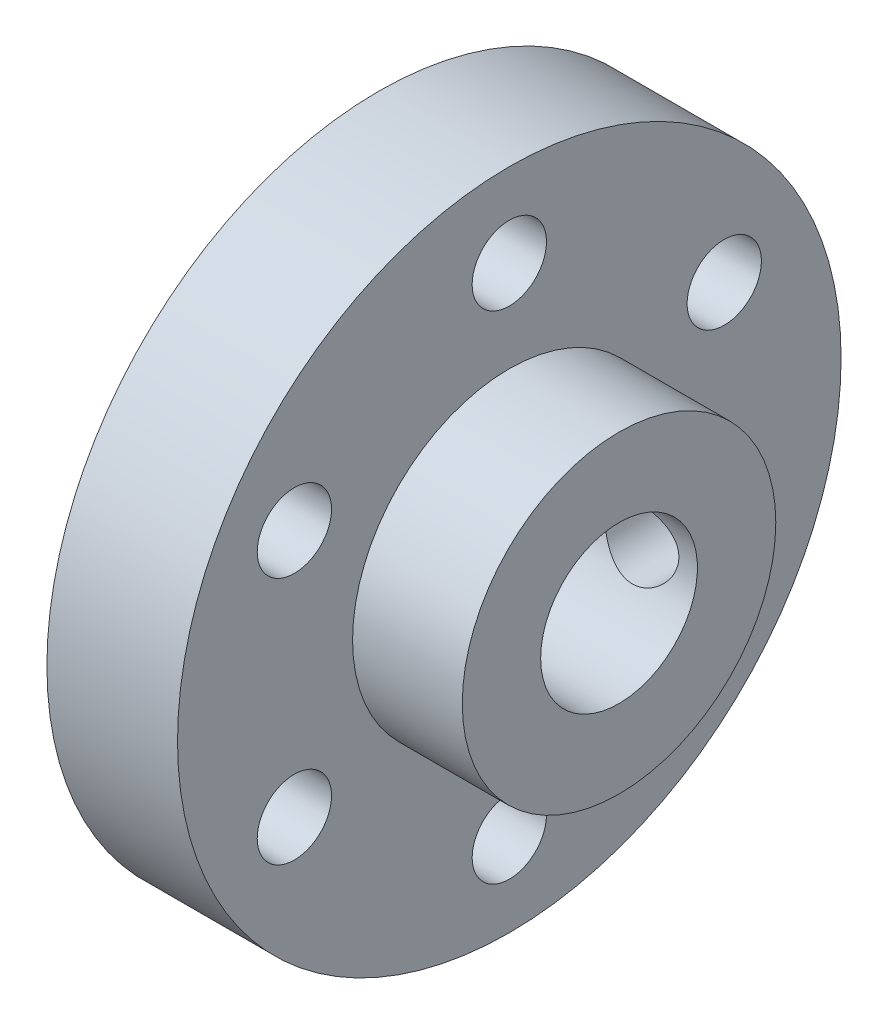
ISO-10303-21;
HEADER;
FILE_DESCRIPTION(('STEP AP214'),'2;1');
FILE_NAME('part.step','',(''),(''),'','','');
FILE_SCHEMA(('AUTOMOTIVE_DESIGN { 1 0 10303 214 1 1 1 1 }'));
ENDSEC;
DATA;
#1=APPLICATION_CONTEXT('core data for automotive mechanical design processes');
#2=APPLICATION_PROTOCOL_DEFINITION('international standard','automotive_design',2000,#1);
#3=PRODUCT_CONTEXT('',#1,'mechanical');
#4=PRODUCT('Part','Part','',(#3));
#5=PRODUCT_RELATED_PRODUCT_CATEGORY('part','',(#4));
#6=PRODUCT_DEFINITION_FORMATION('','',#4);
#7=PRODUCT_DEFINITION_CONTEXT('part definition',#1,'design');
#8=PRODUCT_DEFINITION('design','',#6,#7);
#9=PRODUCT_DEFINITION_SHAPE('','',#8);
#10=(LENGTH_UNIT() NAMED_UNIT(*) SI_UNIT(.MILLI.,.METRE.));
#11=(NAMED_UNIT(*) PLANE_ANGLE_UNIT() SI_UNIT($,.RADIAN.));
#12=(NAMED_UNIT(*) SI_UNIT($,.STERADIAN.) SOLID_ANGLE_UNIT());
#13=UNCERTAINTY_MEASURE_WITH_UNIT(LENGTH_MEASURE(1.E-05),#10,'distance_accuracy_value','');
#14=(GEOMETRIC_REPRESENTATION_CONTEXT(3) GLOBAL_UNCERTAINTY_ASSIGNED_CONTEXT((#13)) GLOBAL_UNIT_ASSIGNED_CONTEXT((#10,
#11,#12)) REPRESENTATION_CONTEXT('',''));
#15=CARTESIAN_POINT('',(0.,0.,0.));
#16=DIRECTION('',(0.,0.,1.));
#17=DIRECTION('',(1.,0.,0.));
#18=AXIS2_PLACEMENT_3D('',#15,#16,#17);
#19=CARTESIAN_POINT('',(9.2,0.,0.));
#20=DIRECTION('',(-1.,0.,0.));
#21=DIRECTION('',(0.,0.,1.));
#22=AXIS2_PLACEMENT_3D('',#19,#20,#21);
#23=CYLINDRICAL_SURFACE('',#22,12.7);
#24=CARTESIAN_POINT('',(3.89168749593449,0.,-12.7));
#25=CARTESIAN_POINT('',(3.89168407550333,0.0796293042126381,-12.6999989871327));
#26=CARTESIAN_POINT('',(3.88497821343914,0.159309950896182,-12.6992431474695));
#27=CARTESIAN_POINT('',(3.8583305375107,0.31645848229174,-12.6963006434276));
#28=CARTESIAN_POINT('',(3.83837448580765,0.39392389314896,-12.6941124399546));
#29=CARTESIAN_POINT('',(3.78581789531775,0.544343810683809,-12.6885519930145));
#30=CARTESIAN_POINT('',(3.75322539065561,0.617301149445109,-12.6851805019979));
#31=CARTESIAN_POINT('',(3.67633759800329,0.756695153161773,-12.6776295583631));
#32=CARTESIAN_POINT('',(3.63204449185674,0.823133030654698,-12.6734502564185));
#33=CARTESIAN_POINT('',(3.53280106281343,0.947913698891423,-12.6647302938183));
#34=CARTESIAN_POINT('',(3.47780905592805,1.00622324398845,-12.6601882621157));
#35=CARTESIAN_POINT('',(3.35881809390447,1.11280602567313,-12.6512659624337));
#36=CARTESIAN_POINT('',(3.29481870381705,1.16107877732429,-12.6468857022788));
#37=CARTESIAN_POINT('',(3.15941766646372,1.24633844237432,-12.6387691712029));
#38=CARTESIAN_POINT('',(3.08799663357491,1.28329475116734,-12.6350346583187));
#39=CARTESIAN_POINT('',(2.93991358063971,1.34467705488147,-12.6286500332387));
#40=CARTESIAN_POINT('',(2.86325172127854,1.36910343377865,-12.6259998878133));
#41=CARTESIAN_POINT('',(2.70720530463408,1.40463271970905,-12.6220968271518));
#42=CARTESIAN_POINT('',(2.62783356641104,1.4157912768195,-12.6208380774707));
#43=CARTESIAN_POINT('',(2.4683347100286,1.42464027431553,-12.6198423534604));
#44=CARTESIAN_POINT('',(2.38820761655593,1.42233115334263,-12.6201053295686));
#45=CARTESIAN_POINT('',(2.22985807794076,1.40435612322354,-12.6221180087784));
#46=CARTESIAN_POINT('',(2.15162860942137,1.38875121819029,-12.6238609214664));
#47=CARTESIAN_POINT('',(1.99890590862589,1.34472262504097,-12.628626495775));
#48=CARTESIAN_POINT('',(1.9244127383341,1.31629872433892,-12.6316491786188));
#49=CARTESIAN_POINT('',(1.78108595579678,1.24737245508685,-12.638641481814));
#50=CARTESIAN_POINT('',(1.71226534471491,1.20684327315166,-12.642613200347));
#51=CARTESIAN_POINT('',(1.58237960169225,1.11487614264004,-12.651054366044));
#52=CARTESIAN_POINT('',(1.5213147548094,1.06343779328984,-12.6555238314909));
#53=CARTESIAN_POINT('',(1.40831963582293,0.95077294336789,-12.664487130628));
#54=CARTESIAN_POINT('',(1.35644183407033,0.889493803968468,-12.6689809621673));
#55=CARTESIAN_POINT('',(1.263700950406,0.759068945739561,-12.677463381429));
#56=CARTESIAN_POINT('',(1.22283788612238,0.689923214320563,-12.6814519683428));
#57=CARTESIAN_POINT('',(1.15328756658665,0.545689750760288,-12.6884763050648));
#58=CARTESIAN_POINT('',(1.12460325540648,0.470600587062248,-12.6915118244338));
#59=CARTESIAN_POINT('',(1.08026458278106,0.316630152907063,-12.69628579102));
#60=CARTESIAN_POINT('',(1.06460973215955,0.237749024932517,-12.6980242869321));
#61=CARTESIAN_POINT('',(1.04684158083999,0.0788878778733906,-12.7000020392876));
#62=CARTESIAN_POINT('',(1.04465593186219,-0.00108395360230105,-12.7002493055474));
#63=CARTESIAN_POINT('',(1.05369779483497,-0.160254835508478,-12.6992382836766));
#64=CARTESIAN_POINT('',(1.06492507852505,-0.239453899066757,-12.6979800211671));
#65=CARTESIAN_POINT('',(1.10041404448931,-0.39462014791938,-12.6941043777926));
#66=CARTESIAN_POINT('',(1.12464156984857,-0.470595241958787,-12.6914905591246));
#67=CARTESIAN_POINT('',(1.18540800183802,-0.617403450816285,-12.6851967512027));
#68=CARTESIAN_POINT('',(1.22194724995903,-0.68823642294086,-12.6815167323759));
#69=CARTESIAN_POINT('',(1.30647735055756,-0.823075008004148,-12.6734815498615));
#70=CARTESIAN_POINT('',(1.35451540517911,-0.887050863020743,-12.6691236299357));
#71=CARTESIAN_POINT('',(1.46061222588598,-1.0060572548423,-12.6602297305019));
#72=CARTESIAN_POINT('',(1.51867130905044,-1.06108750848909,-12.6556937453631));
#73=CARTESIAN_POINT('',(1.64347916605927,-1.16089428800412,-12.6469305654468));
#74=CARTESIAN_POINT('',(1.71026620547669,-1.20562311310534,-12.642704866546));
#75=CARTESIAN_POINT('',(1.85044679166697,-1.28322870319522,-12.635064351553));
#76=CARTESIAN_POINT('',(1.92384022857086,-1.31610566524307,-12.631649521979));
#77=CARTESIAN_POINT('',(2.07499104239227,-1.36899560100578,-12.6260271560458));
#78=CARTESIAN_POINT('',(2.15273862367222,-1.38903628119628,-12.6238170209615));
#79=CARTESIAN_POINT('',(2.31052152899563,-1.41577437973492,-12.6208465174718));
#80=CARTESIAN_POINT('',(2.39055676900608,-1.42247228756836,-12.620086095883));
#81=CARTESIAN_POINT('',(2.55016880184294,-1.42232693358569,-12.6201024413793));
#82=CARTESIAN_POINT('',(2.62974567428931,-1.41555860254547,-12.6208707023522));
#83=CARTESIAN_POINT('',(2.78662381672738,-1.38883071717907,-12.6238396456315));
#84=CARTESIAN_POINT('',(2.86392508510624,-1.36887115350393,-12.6260403289532));
#85=CARTESIAN_POINT('',(3.01405288896598,-1.31634933598876,-12.6316236747729));
#86=CARTESIAN_POINT('',(3.08688043201978,-1.28378993203385,-12.6350060699695));
#87=CARTESIAN_POINT('',(3.22604957135175,-1.20700017200153,-12.6425722291317));
#88=CARTESIAN_POINT('',(3.2923911502871,-1.16276978471822,-12.64675599524));
#89=CARTESIAN_POINT('',(3.41708890157704,-1.06361349101632,-12.6554814059422));
#90=CARTESIAN_POINT('',(3.47540050581258,-1.00863169147623,-12.6600248435396));
#91=CARTESIAN_POINT('',(3.58200037187087,-0.889647504417425,-12.6689415011601));
#92=CARTESIAN_POINT('',(3.63028624762758,-0.825642975612048,-12.673314680462));
#93=CARTESIAN_POINT('',(3.71558639267365,-0.690208318791703,-12.681412588346));
#94=CARTESIAN_POINT('',(3.75256540482219,-0.618755876946853,-12.6851352733957));
#95=CARTESIAN_POINT('',(3.81394924118907,-0.470656917760391,-12.6914913703169));
#96=CARTESIAN_POINT('',(3.83836801098677,-0.394016268359459,-12.6941259896191));
#97=CARTESIAN_POINT('',(3.86795904168752,-0.26413176330473,-12.6973592103633));
#98=CARTESIAN_POINT('',(3.87684477192835,-0.211713399275616,-12.6983447957744));
#99=CARTESIAN_POINT('',(3.88871012353418,-0.106204301833843,-12.6996655265998));
#100=CARTESIAN_POINT('',(3.89168977739756,-0.0531135721225154,-12.700000675593));
#101=CARTESIAN_POINT('',(3.89168749593449,0.,-12.7));
#102=B_SPLINE_CURVE_WITH_KNOTS('',3,(#24,#25,#26,#27,#28,#29,#30,#31,#32,#33,#34,#35,#36,#37,
#38,#39,#40,#41,#42,#43,#44,#45,#46,#47,#48,#49,#50,#51,#52,#53,#54,#55,#56,#57,#58,#59,#60,#61,
#62,#63,#64,#65,#66,#67,#68,#69,#70,#71,#72,#73,#74,#75,#76,#77,#78,#79,#80,#81,#82,#83,#84,#85,
#86,#87,#88,#89,#90,#91,#92,#93,#94,#95,#96,#97,#98,#99,#100,#101),.UNSPECIFIED.,.T.,.F.,(4,2,2,
2,2,2,2,2,2,2,2,2,2,2,2,2,2,2,2,2,2,2,2,2,2,2,2,2,2,2,2,2,2,2,2,2,2,2,4),(0.,0.238693936836993,
0.477644775482566,0.716443940156791,0.955198606683063,1.19490281907231,1.43461861029127,
1.67497708578614,1.91532819512503,2.15466758759963,2.39399918484726,2.6322385508201,
2.87048186782087,3.10925686113529,3.3480406279273,3.58814702871219,3.82825381376321,
4.06841860883549,4.30857438678746,4.54743906296058,4.7862996742067,5.02453575274213,
5.2627784397865,5.50201640129647,5.7412619340131,5.98159396585652,6.22192200154989,
6.46172953732751,6.70152827550158,6.93999642276735,7.17846473904161,7.4168791490403,
7.65529419651833,7.89498332033177,8.13472942356464,8.37521565509708,8.61543429636363,
8.77464650493228,8.93385783742797),.UNSPECIFIED.);
#103=CARTESIAN_POINT('',(3.89168749593449,0.,-12.7));
#104=VERTEX_POINT('',#103);
#105=EDGE_CURVE('E76',#104,#104,#102,.T.);
#106=ORIENTED_EDGE('',*,*,#105,.T.);
#107=EDGE_LOOP('',(#106));
#108=FACE_BOUND('',#107,.T.);
#109=CARTESIAN_POINT('',(0.,0.,0.));
#110=DIRECTION('',(1.,0.,0.));
#111=DIRECTION('',(0.,0.,-1.));
#112=AXIS2_PLACEMENT_3D('',#109,#110,#111);
#113=CIRCLE('',#112,12.7);
#114=CARTESIAN_POINT('',(0.,0.,-12.7));
#115=VERTEX_POINT('',#114);
#116=EDGE_CURVE('E10',#115,#115,#113,.T.);
#117=ORIENTED_EDGE('',*,*,#116,.T.);
#118=EDGE_LOOP('',(#117));
#119=FACE_BOUND('',#118,.T.);
#120=CARTESIAN_POINT('',(5.,0.,0.));
#121=DIRECTION('',(1.,0.,0.));
#122=DIRECTION('',(0.,0.,-1.));
#123=AXIS2_PLACEMENT_3D('',#120,#121,#122);
#124=CIRCLE('',#123,12.7);
#125=CARTESIAN_POINT('',(5.,0.,-12.7));
#126=VERTEX_POINT('',#125);
#127=EDGE_CURVE('E43',#126,#126,#124,.T.);
#128=ORIENTED_EDGE('',*,*,#127,.F.);
#129=EDGE_LOOP('',(#128));
#130=FACE_BOUND('',#129,.T.);
#131=ADVANCED_FACE('F31',(#108,#119,#130),#23,.T.);
#132=CARTESIAN_POINT('',(0.,0.,0.));
#133=DIRECTION('',(1.,0.,0.));
#134=DIRECTION('',(0.,0.,-1.));
#135=AXIS2_PLACEMENT_3D('',#132,#133,#134);
#136=PLANE('',#135);
#137=CARTESIAN_POINT('',(0.,-4.74999999999998,8.22724133595218));
#138=DIRECTION('',(-1.,0.,0.));
#139=DIRECTION('',(0.,0.,1.));
#140=AXIS2_PLACEMENT_3D('',#137,#138,#139);
#141=CIRCLE('',#140,1.4224);
#142=CARTESIAN_POINT('',(0.,-4.74999999999998,9.64964133595218));
#143=VERTEX_POINT('',#142);
#144=EDGE_CURVE('E99',#143,#143,#141,.T.);
#145=ORIENTED_EDGE('',*,*,#144,.F.);
#146=EDGE_LOOP('',(#145));
#147=FACE_BOUND('',#146,.T.);
#148=CARTESIAN_POINT('',(0.,-9.5,0.));
#149=DIRECTION('',(-1.,0.,0.));
#150=DIRECTION('',(0.,0.,1.));
#151=AXIS2_PLACEMENT_3D('',#148,#149,#150);
#152=CIRCLE('',#151,1.4224);
#153=CARTESIAN_POINT('',(0.,-9.5,1.42240000000003));
#154=VERTEX_POINT('',#153);
#155=EDGE_CURVE('E106',#154,#154,#152,.T.);
#156=ORIENTED_EDGE('',*,*,#155,.F.);
#157=EDGE_LOOP('',(#156));
#158=FACE_BOUND('',#157,.T.);
#159=CARTESIAN_POINT('',(0.,9.5,0.));
#160=DIRECTION('',(-1.,0.,0.));
#161=DIRECTION('',(0.,0.,1.));
#162=AXIS2_PLACEMENT_3D('',#159,#160,#161);
#163=CIRCLE('',#162,1.4224);
#164=CARTESIAN_POINT('',(0.,9.5,1.4224));
#165=VERTEX_POINT('',#164);
#166=EDGE_CURVE('E102',#165,#165,#163,.T.);
#167=ORIENTED_EDGE('',*,*,#166,.F.);
#168=EDGE_LOOP('',(#167));
#169=FACE_BOUND('',#168,.T.);
#170=CARTESIAN_POINT('',(0.,4.7499999999999,-8.22724133595223));
#171=DIRECTION('',(-1.,0.,0.));
#172=DIRECTION('',(0.,0.,1.));
#173=AXIS2_PLACEMENT_3D('',#170,#171,#172);
#174=CIRCLE('',#173,1.4224);
#175=CARTESIAN_POINT('',(0.,4.7499999999999,-6.80484133595223));
#176=VERTEX_POINT('',#175);
#177=EDGE_CURVE('E105',#176,#176,#174,.T.);
#178=ORIENTED_EDGE('',*,*,#177,.F.);
#179=EDGE_LOOP('',(#178));
#180=FACE_BOUND('',#179,.T.);
#181=CARTESIAN_POINT('',(0.,4.74999999999998,8.22724133595218));
#182=DIRECTION('',(-1.,0.,0.));
#183=DIRECTION('',(0.,0.,1.));
#184=AXIS2_PLACEMENT_3D('',#181,#182,#183);
#185=CIRCLE('',#184,1.4224);
#186=CARTESIAN_POINT('',(0.,4.74999999999998,9.64964133595218));
#187=VERTEX_POINT('',#186);
#188=EDGE_CURVE('E113',#187,#187,#185,.T.);
#189=ORIENTED_EDGE('',*,*,#188,.F.);
#190=EDGE_LOOP('',(#189));
#191=FACE_BOUND('',#190,.T.);
#192=CARTESIAN_POINT('',(0.,-4.75000000000007,-8.22724133595213));
#193=DIRECTION('',(-1.,0.,0.));
#194=DIRECTION('',(0.,0.,1.));
#195=AXIS2_PLACEMENT_3D('',#192,#193,#194);
#196=CIRCLE('',#195,1.4224);
#197=CARTESIAN_POINT('',(0.,-4.75000000000007,-6.80484133595213));
#198=VERTEX_POINT('',#197);
#199=EDGE_CURVE('E56',#198,#198,#196,.T.);
#200=ORIENTED_EDGE('',*,*,#199,.F.);
#201=EDGE_LOOP('',(#200));
#202=FACE_BOUND('',#201,.T.);
#203=CARTESIAN_POINT('',(0.,0.,0.));
#204=DIRECTION('',(-1.,0.,0.));
#205=DIRECTION('',(0.,0.,1.));
#206=AXIS2_PLACEMENT_3D('',#203,#204,#205);
#207=CIRCLE('',#206,3.);
#208=CARTESIAN_POINT('',(0.,0.,3.));
#209=VERTEX_POINT('',#208);
#210=EDGE_CURVE('E70',#209,#209,#207,.T.);
#211=ORIENTED_EDGE('',*,*,#210,.F.);
#212=EDGE_LOOP('',(#211));
#213=FACE_BOUND('',#212,.T.);
#214=ORIENTED_EDGE('',*,*,#116,.F.);
#215=EDGE_LOOP('',(#214));
#216=FACE_BOUND('',#215,.T.);
#217=ADVANCED_FACE('F140',(#147,#158,#169,#180,#191,#202,#213,#216),#136,.F.);
#218=CARTESIAN_POINT('',(5.,0.,0.));
#219=DIRECTION('',(1.,0.,0.));
#220=DIRECTION('',(0.,0.,-1.));
#221=AXIS2_PLACEMENT_3D('',#218,#219,#220);
#222=PLANE('',#221);
#223=CARTESIAN_POINT('',(5.,-4.74999999999998,8.22724133595218));
#224=DIRECTION('',(1.,0.,0.));
#225=DIRECTION('',(0.,0.,-1.));
#226=AXIS2_PLACEMENT_3D('',#223,#224,#225);
#227=CIRCLE('',#226,1.4224);
#228=CARTESIAN_POINT('',(5.,-4.74999999999998,6.80484133595218));
#229=VERTEX_POINT('',#228);
#230=EDGE_CURVE('E68',#229,#229,#227,.T.);
#231=ORIENTED_EDGE('',*,*,#230,.F.);
#232=EDGE_LOOP('',(#231));
#233=FACE_BOUND('',#232,.T.);
#234=CARTESIAN_POINT('',(5.,-9.5,0.));
#235=DIRECTION('',(1.,0.,0.));
#236=DIRECTION('',(0.,0.,-1.));
#237=AXIS2_PLACEMENT_3D('',#234,#235,#236);
#238=CIRCLE('',#237,1.4224);
#239=CARTESIAN_POINT('',(5.,-9.5,-1.42239999999997));
#240=VERTEX_POINT('',#239);
#241=EDGE_CURVE('E65',#240,#240,#238,.T.);
#242=ORIENTED_EDGE('',*,*,#241,.F.);
#243=EDGE_LOOP('',(#242));
#244=FACE_BOUND('',#243,.T.);
#245=CARTESIAN_POINT('',(5.,9.5,0.));
#246=DIRECTION('',(1.,0.,0.));
#247=DIRECTION('',(0.,0.,-1.));
#248=AXIS2_PLACEMENT_3D('',#245,#246,#247);
#249=CIRCLE('',#248,1.4224);
#250=CARTESIAN_POINT('',(5.,9.5,-1.4224));
#251=VERTEX_POINT('',#250);
#252=EDGE_CURVE('E62',#251,#251,#249,.T.);
#253=ORIENTED_EDGE('',*,*,#252,.F.);
#254=EDGE_LOOP('',(#253));
#255=FACE_BOUND('',#254,.T.);
#256=CARTESIAN_POINT('',(5.,4.7499999999999,-8.22724133595223));
#257=DIRECTION('',(1.,0.,0.));
#258=DIRECTION('',(0.,0.,-1.));
#259=AXIS2_PLACEMENT_3D('',#256,#257,#258);
#260=CIRCLE('',#259,1.4224);
#261=CARTESIAN_POINT('',(5.,4.7499999999999,-9.64964133595223));
#262=VERTEX_POINT('',#261);
#263=EDGE_CURVE('E59',#262,#262,#260,.T.);
#264=ORIENTED_EDGE('',*,*,#263,.F.);
#265=EDGE_LOOP('',(#264));
#266=FACE_BOUND('',#265,.T.);
#267=CARTESIAN_POINT('',(5.,4.74999999999998,8.22724133595218));
#268=DIRECTION('',(1.,0.,0.));
#269=DIRECTION('',(0.,0.,-1.));
#270=AXIS2_PLACEMENT_3D('',#267,#268,#269);
#271=CIRCLE('',#270,1.4224);
#272=CARTESIAN_POINT('',(5.,4.74999999999998,6.80484133595218));
#273=VERTEX_POINT('',#272);
#274=EDGE_CURVE('E55',#273,#273,#271,.T.);
#275=ORIENTED_EDGE('',*,*,#274,.F.);
#276=EDGE_LOOP('',(#275));
#277=FACE_BOUND('',#276,.T.);
#278=CARTESIAN_POINT('',(5.,-4.75000000000007,-8.22724133595213));
#279=DIRECTION('',(1.,0.,0.));
#280=DIRECTION('',(0.,0.,-1.));
#281=AXIS2_PLACEMENT_3D('',#278,#279,#280);
#282=CIRCLE('',#281,1.4224);
#283=CARTESIAN_POINT('',(5.,-4.75000000000007,-9.64964133595213));
#284=VERTEX_POINT('',#283);
#285=EDGE_CURVE('E52',#284,#284,#282,.T.);
#286=ORIENTED_EDGE('',*,*,#285,.F.);
#287=EDGE_LOOP('',(#286));
#288=FACE_BOUND('',#287,.T.);
#289=CARTESIAN_POINT('',(5.,0.,0.));
#290=DIRECTION('',(1.,0.,0.));
#291=DIRECTION('',(0.,0.,-1.));
#292=AXIS2_PLACEMENT_3D('',#289,#290,#291);
#293=CIRCLE('',#292,6.);
#294=CARTESIAN_POINT('',(5.,0.,-6.));
#295=VERTEX_POINT('',#294);
#296=EDGE_CURVE('E48',#295,#295,#293,.T.);
#297=ORIENTED_EDGE('',*,*,#296,.F.);
#298=EDGE_LOOP('',(#297));
#299=FACE_BOUND('',#298,.T.);
#300=ORIENTED_EDGE('',*,*,#127,.T.);
#301=EDGE_LOOP('',(#300));
#302=FACE_BOUND('',#301,.T.);
#303=ADVANCED_FACE('F132',(#233,#244,#255,#266,#277,#288,#299,#302),#222,.T.);
#304=CARTESIAN_POINT('',(5.,0.,0.));
#305=DIRECTION('',(1.,0.,0.));
#306=DIRECTION('',(0.,0.,-1.));
#307=AXIS2_PLACEMENT_3D('',#304,#305,#306);
#308=CYLINDRICAL_SURFACE('',#307,6.);
#309=CARTESIAN_POINT('',(5.64688749593449,0.,-6.));
#310=CARTESIAN_POINT('',(5.64688992597994,0.0787177685685404,-5.99999859765227));
#311=CARTESIAN_POINT('',(5.65344405940375,0.157463586606879,-5.9984353102767));
#312=CARTESIAN_POINT('',(5.67945334707992,0.312706951877036,-5.99235030537756));
#313=CARTESIAN_POINT('',(5.69891662899273,0.389203050967231,-5.98782672406298));
#314=CARTESIAN_POINT('',(5.75009125820451,0.53768196791325,-5.9763232316239));
#315=CARTESIAN_POINT('',(5.78178870892622,0.609669799189784,-5.96934610823121));
#316=CARTESIAN_POINT('',(5.85648501588576,0.747305003081661,-5.95368284360752));
#317=CARTESIAN_POINT('',(5.89948396992746,0.812952320819115,-5.94499668758661));
#318=CARTESIAN_POINT('',(5.99641083383026,0.937268897817115,-5.92668082432269));
#319=CARTESIAN_POINT('',(6.05050963563338,0.995802957166398,-5.91703775677153));
#320=CARTESIAN_POINT('',(6.16773422109844,1.10305753643497,-5.89798592631227));
#321=CARTESIAN_POINT('',(6.23086092634157,1.1517770532474,-5.88857718744002));
#322=CARTESIAN_POINT('',(6.36537765455918,1.23863849545355,-5.87092594921982));
#323=CARTESIAN_POINT('',(6.4368657477476,1.27663231923114,-5.86270048224347));
#324=CARTESIAN_POINT('',(6.58544006738293,1.34001251065078,-5.84854069205495));
#325=CARTESIAN_POINT('',(6.66252549527901,1.36540067266061,-5.84260604278041));
#326=CARTESIAN_POINT('',(6.81862798519744,1.40239378445991,-5.83383664464704));
#327=CARTESIAN_POINT('',(6.89758469227601,1.41424026983096,-5.8309476473232));
#328=CARTESIAN_POINT('',(7.05641361927348,1.42456555121915,-5.82843404894199));
#329=CARTESIAN_POINT('',(7.13628570438899,1.42304629091251,-5.82880897323786));
#330=CARTESIAN_POINT('',(7.29285114497425,1.40687662729339,-5.83273194062304));
#331=CARTESIAN_POINT('',(7.36957588919922,1.39251088783242,-5.83621119152143));
#332=CARTESIAN_POINT('',(7.51949418283249,1.35150882325018,-5.84584153207246));
#333=CARTESIAN_POINT('',(7.59268750307871,1.32487170299126,-5.85199279485958));
#334=CARTESIAN_POINT('',(7.73424434794727,1.25983244633938,-5.86633918737308));
#335=CARTESIAN_POINT('',(7.80255727348691,1.22132438134918,-5.87455259061684));
#336=CARTESIAN_POINT('',(7.93185523015639,1.13371058158765,-5.89208713038852));
#337=CARTESIAN_POINT('',(7.99283909679994,1.08460316618235,-5.90140844248114));
#338=CARTESIAN_POINT('',(8.10738249642011,0.975696221511965,-5.92040055727288));
#339=CARTESIAN_POINT('',(8.16071264645173,0.915655658729797,-5.93007420591432));
#340=CARTESIAN_POINT('',(8.25658819533763,0.787369749450404,-5.9484654543337));
#341=CARTESIAN_POINT('',(8.2991333267874,0.719124199580002,-5.95718303040366));
#342=CARTESIAN_POINT('',(8.37230339351258,0.576058624576064,-5.9727164434281));
#343=CARTESIAN_POINT('',(8.40289416839688,0.501220496748445,-5.97952681492579));
#344=CARTESIAN_POINT('',(8.4509994115948,0.347267573819371,-5.9904384313872));
#345=CARTESIAN_POINT('',(8.46851612247247,0.268153514656363,-5.99454014094754));
#346=CARTESIAN_POINT('',(8.48963286443022,0.109858377343459,-5.99950464928435));
#347=CARTESIAN_POINT('',(8.493545669019,0.0307212468331392,-6.00044022831377));
#348=CARTESIAN_POINT('',(8.48819705033458,-0.127076389632865,-5.99917291906086));
#349=CARTESIAN_POINT('',(8.47893668629691,-0.205736933399472,-5.99697028311786));
#350=CARTESIAN_POINT('',(8.44776315996342,-0.359283299987231,-5.98972037893135));
#351=CARTESIAN_POINT('',(8.42601781351043,-0.434205135738388,-5.98471086027588));
#352=CARTESIAN_POINT('',(8.3706809476893,-0.579335720479553,-5.97240981882881));
#353=CARTESIAN_POINT('',(8.33708830619995,-0.64954402227526,-5.96511807988317));
#354=CARTESIAN_POINT('',(8.25838487839401,-0.784520103628585,-5.94888466699777));
#355=CARTESIAN_POINT('',(8.21309522895961,-0.849180517448246,-5.93991803068973));
#356=CARTESIAN_POINT('',(8.11251491250953,-0.970095243664806,-5.92137345499039));
#357=CARTESIAN_POINT('',(8.05722270311258,-1.02634825720553,-5.91179542147006));
#358=CARTESIAN_POINT('',(7.93676123428309,-1.13011820261883,-5.89285001902268));
#359=CARTESIAN_POINT('',(7.87140219349156,-1.17741684582211,-5.88349185675045));
#360=CARTESIAN_POINT('',(7.73348716743581,-1.26037092410306,-5.86628221735316));
#361=CARTESIAN_POINT('',(7.66093150436865,-1.29602688012427,-5.85843067282209));
#362=CARTESIAN_POINT('',(7.51107891523097,-1.35442562899282,-5.84520557649645));
#363=CARTESIAN_POINT('',(7.43381291226329,-1.37724431345276,-5.83981749739603));
#364=CARTESIAN_POINT('',(7.27639621715076,-1.40953186231968,-5.83210944590447));
#365=CARTESIAN_POINT('',(7.19624608433652,-1.41900330105318,-5.82978888187711));
#366=CARTESIAN_POINT('',(7.03754843198655,-1.42420342714354,-5.82852041145535));
#367=CARTESIAN_POINT('',(6.95901279221471,-1.42027972335911,-5.82948719457442));
#368=CARTESIAN_POINT('',(6.803756766476,-1.3995885920781,-5.83448908726606));
#369=CARTESIAN_POINT('',(6.72703635089998,-1.38282137422848,-5.83852414675461));
#370=CARTESIAN_POINT('',(6.57792288219727,-1.33709993573101,-5.84916288422971));
#371=CARTESIAN_POINT('',(6.50551080421149,-1.3082046717788,-5.85575412451477));
#372=CARTESIAN_POINT('',(6.36651368539831,-1.23909524493706,-5.87076552707611));
#373=CARTESIAN_POINT('',(6.29992937093715,-1.19887967372272,-5.87918591688152));
#374=CARTESIAN_POINT('',(6.17278340322474,-1.10715446393343,-5.89715508778462));
#375=CARTESIAN_POINT('',(6.11240087653888,-1.05540077922276,-5.90672580167518));
#376=CARTESIAN_POINT('',(6.00106411991042,-0.942552310032349,-5.92577957335817));
#377=CARTESIAN_POINT('',(5.95011210119389,-0.881455340895839,-5.93526261009846));
#378=CARTESIAN_POINT('',(5.85830168601404,-0.75048748278497,-5.95325132299058));
#379=CARTESIAN_POINT('',(5.81761586439939,-0.680492998394184,-5.96173914847424));
#380=CARTESIAN_POINT('',(5.74865273292809,-0.534466616440597,-5.97659713288366));
#381=CARTESIAN_POINT('',(5.72036587095364,-0.458439419980437,-5.98296892107711));
#382=CARTESIAN_POINT('',(5.68156815903056,-0.318709672521574,-5.99185027618024));
#383=CARTESIAN_POINT('',(5.66858956550768,-0.255714155098128,-5.99488633303014));
#384=CARTESIAN_POINT('',(5.65124850333731,-0.128485270785468,-5.99896170674802));
#385=CARTESIAN_POINT('',(5.64688551245309,-0.0642519791625573,-6.0000011446414));
#386=CARTESIAN_POINT('',(5.64688749593449,0.,-6.));
#387=B_SPLINE_CURVE_WITH_KNOTS('',3,(#309,#310,#311,#312,#313,#314,#315,#316,#317,#318,#319,
#320,#321,#322,#323,#324,#325,#326,#327,#328,#329,#330,#331,#332,#333,#334,#335,#336,#337,#338,
#339,#340,#341,#342,#343,#344,#345,#346,#347,#348,#349,#350,#351,#352,#353,#354,#355,#356,#357,
#358,#359,#360,#361,#362,#363,#364,#365,#366,#367,#368,#369,#370,#371,#372,#373,#374,#375,#376,
#377,#378,#379,#380,#381,#382,#383,#384,#385,#386),.UNSPECIFIED.,.T.,.F.,(4,2,2,2,2,2,2,2,2,2,2,
2,2,2,2,2,2,2,2,2,2,2,2,2,2,2,2,2,2,2,2,2,2,2,2,2,2,2,4),(0.,0.23591796506773,0.471984606370567,
0.70778388913364,0.943585212584313,1.1833336194746,1.42310651771462,1.66604418621041,
1.90894726353646,2.14744667889538,2.38591141171673,2.61921948172923,2.85254267132237,
3.08801129640403,3.32351728487613,3.56503778790801,3.80656427863031,4.04877598729792,
4.29094614039579,4.52751023977052,4.76405531844128,4.99749294345769,5.23095268455168,
5.46821877330056,5.70552147939468,5.94802088111212,6.19050943088371,6.43154894839945,
6.67254196947649,6.90732918087439,7.14211255988087,7.37576759512122,7.6094517115269,
7.84864840076307,8.08790110498234,8.33094168630633,8.57379469946212,8.76637021770538,
8.95893406258122),.UNSPECIFIED.);
#388=CARTESIAN_POINT('',(5.64688749593449,0.,-6.));
#389=VERTEX_POINT('',#388);
#390=EDGE_CURVE('E77',#389,#389,#387,.T.);
#391=ORIENTED_EDGE('',*,*,#390,.F.);
#392=EDGE_LOOP('',(#391));
#393=FACE_BOUND('',#392,.T.);
#394=ORIENTED_EDGE('',*,*,#296,.T.);
#395=EDGE_LOOP('',(#394));
#396=FACE_BOUND('',#395,.T.);
#397=CARTESIAN_POINT('',(9.2,0.,0.));
#398=DIRECTION('',(1.,0.,0.));
#399=DIRECTION('',(0.,0.,-1.));
#400=AXIS2_PLACEMENT_3D('',#397,#398,#399);
#401=CIRCLE('',#400,6.);
#402=CARTESIAN_POINT('',(9.2,0.,-6.));
#403=VERTEX_POINT('',#402);
#404=EDGE_CURVE('E121',#403,#403,#401,.T.);
#405=ORIENTED_EDGE('',*,*,#404,.F.);
#406=EDGE_LOOP('',(#405));
#407=FACE_BOUND('',#406,.T.);
#408=ADVANCED_FACE('F130',(#393,#396,#407),#308,.T.);
#409=CARTESIAN_POINT('',(9.2,0.,0.));
#410=DIRECTION('',(1.,0.,0.));
#411=DIRECTION('',(0.,0.,-1.));
#412=AXIS2_PLACEMENT_3D('',#409,#410,#411);
#413=PLANE('',#412);
#414=CARTESIAN_POINT('',(9.2,0.,0.));
#415=DIRECTION('',(-1.,0.,0.));
#416=DIRECTION('',(0.,0.,1.));
#417=AXIS2_PLACEMENT_3D('',#414,#415,#416);
#418=CIRCLE('',#417,3.);
#419=CARTESIAN_POINT('',(9.2,0.,3.));
#420=VERTEX_POINT('',#419);
#421=EDGE_CURVE('E118',#420,#420,#418,.T.);
#422=ORIENTED_EDGE('',*,*,#421,.T.);
#423=EDGE_LOOP('',(#422));
#424=FACE_BOUND('',#423,.T.);
#425=ORIENTED_EDGE('',*,*,#404,.T.);
#426=EDGE_LOOP('',(#425));
#427=FACE_BOUND('',#426,.T.);
#428=ADVANCED_FACE('F128',(#424,#427),#413,.T.);
#429=CARTESIAN_POINT('',(9.2,0.,0.));
#430=DIRECTION('',(-1.,0.,0.));
#431=DIRECTION('',(0.,0.,1.));
#432=AXIS2_PLACEMENT_3D('',#429,#430,#431);
#433=CYLINDRICAL_SURFACE('',#432,3.);
#434=CARTESIAN_POINT('',(8.49168749593449,0.,-3.));
#435=CARTESIAN_POINT('',(8.49168321812599,-0.0752342945546673,-2.99999637914269));
#436=CARTESIAN_POINT('',(8.48568333817934,-0.150571774164745,-2.99713890262885));
#437=CARTESIAN_POINT('',(8.46193570629414,-0.299048768865879,-2.98599083604384));
#438=CARTESIAN_POINT('',(8.4441627215494,-0.372183209522934,-2.97768857677752));
#439=CARTESIAN_POINT('',(8.3977044262071,-0.51387471448776,-2.95652589709493));
#440=CARTESIAN_POINT('',(8.36905998812726,-0.582447806518403,-2.94368256161316));
#441=CARTESIAN_POINT('',(8.30186923240143,-0.713726988407302,-2.91463894709074));
#442=CARTESIAN_POINT('',(8.26332437534309,-0.776433941824458,-2.89843916328784));
#443=CARTESIAN_POINT('',(8.17495797790739,-0.898155533101873,-2.8631371896875));
#444=CARTESIAN_POINT('',(8.12462568251375,-0.956766540654325,-2.84392324619662));
#445=CARTESIAN_POINT('',(8.01520464757336,-1.06508016924197,-2.80515950152649));
#446=CARTESIAN_POINT('',(7.95610999827182,-1.11477672756312,-2.78560948160991));
#447=CARTESIAN_POINT('',(7.82601416067637,-1.2072181463733,-2.74687195986213));
#448=CARTESIAN_POINT('',(7.75447710377607,-1.24926234066546,-2.72779910188099));
#449=CARTESIAN_POINT('',(7.60433244818822,-1.32054595428229,-2.69401658218005));
#450=CARTESIAN_POINT('',(7.52572953058439,-1.34979377684221,-2.67930405913108));
#451=CARTESIAN_POINT('',(7.3682803999913,-1.39287432754852,-2.65715288985595));
#452=CARTESIAN_POINT('',(7.2897019223718,-1.40748869995231,-2.64934835554628));
#453=CARTESIAN_POINT('',(7.13085175701723,-1.42330183964328,-2.64089028799986));
#454=CARTESIAN_POINT('',(7.05058151491338,-1.42451162996128,-2.64023087910021));
#455=CARTESIAN_POINT('',(6.89965040691301,-1.41405870977614,-2.64583775893172));
#456=CARTESIAN_POINT('',(6.82886421494525,-1.40373196923779,-2.65138535904036));
#457=CARTESIAN_POINT('',(6.69018293722037,-1.37278964907167,-2.66753630939487));
#458=CARTESIAN_POINT('',(6.62228863525358,-1.35217129912113,-2.6781410208931));
#459=CARTESIAN_POINT('',(6.48941376736597,-1.30083125802539,-2.70345517175801));
#460=CARTESIAN_POINT('',(6.42453728613657,-1.26988635359619,-2.71825409872217));
#461=CARTESIAN_POINT('',(6.30060240394492,-1.19893678546633,-2.75028430804653));
#462=CARTESIAN_POINT('',(6.24154658565586,-1.15892812584626,-2.76751666196078));
#463=CARTESIAN_POINT('',(6.12393483899057,-1.06572684878405,-2.80482017250881));
#464=CARTESIAN_POINT('',(6.06618255278263,-1.01155740194804,-2.82499259902443));
#465=CARTESIAN_POINT('',(5.96026787294578,-0.894175228435978,-2.86431167680532));
#466=CARTESIAN_POINT('',(5.91210921303762,-0.830958997246822,-2.88345792658457));
#467=CARTESIAN_POINT('',(5.82506216151693,-0.694215209680142,-2.91945943919332));
#468=CARTESIAN_POINT('',(5.78659371675136,-0.620387902977188,-2.93620053738489));
#469=CARTESIAN_POINT('',(5.72291888885814,-0.466312620070243,-2.96456907342605));
#470=CARTESIAN_POINT('',(5.69770299623626,-0.386069295507786,-2.97620017701469));
#471=CARTESIAN_POINT('',(5.66314537183064,-0.228067050940559,-2.99229011553988));
#472=CARTESIAN_POINT('',(5.65273136222109,-0.150592160293322,-2.99723201761226));
#473=CARTESIAN_POINT('',(5.64476385778854,0.00515222386873061,-3.00100499273345));
#474=CARTESIAN_POINT('',(5.64720514354017,0.0834213820192801,-2.99983854585636));
#475=CARTESIAN_POINT('',(5.66420442783835,0.232885176470288,-2.99182034973655));
#476=CARTESIAN_POINT('',(5.67792640812269,0.30419873585309,-2.98536096710625));
#477=CARTESIAN_POINT('',(5.71583536446474,0.44338900599788,-2.96788290235356));
#478=CARTESIAN_POINT('',(5.74002354935282,0.511265318751363,-2.95686369358476));
#479=CARTESIAN_POINT('',(5.79889287153645,0.644012659621916,-2.93086397498461));
#480=CARTESIAN_POINT('',(5.83386989332515,0.708730188822583,-2.9157734978181));
#481=CARTESIAN_POINT('',(5.91299930790306,0.83160433839892,-2.88313756806418));
#482=CARTESIAN_POINT('',(5.95715572365199,0.88975806482379,-2.8655910401935));
#483=CARTESIAN_POINT('',(6.0580076659926,1.00340148657173,-2.82791170718133));
#484=CARTESIAN_POINT('',(6.11547494986468,1.05817778020101,-2.80768837754387));
#485=CARTESIAN_POINT('',(6.23893452394424,1.15759306709106,-2.76818460961426));
#486=CARTESIAN_POINT('',(6.30493124159207,1.20222676213007,-2.74890466823));
#487=CARTESIAN_POINT('',(6.44663257563099,1.28153949458533,-2.71286316813829));
#488=CARTESIAN_POINT('',(6.52259987317088,1.31580568290437,-2.69621626047838));
#489=CARTESIAN_POINT('',(6.68027481803372,1.37070730369408,-2.66872995876708));
#490=CARTESIAN_POINT('',(6.76197574970097,1.3913583978023,-2.65788389464433));
#491=CARTESIAN_POINT('',(6.92075015459256,1.41669217127046,-2.64446028175089));
#492=CARTESIAN_POINT('',(6.99756076162054,1.42266572490349,-2.6412155983092));
#493=CARTESIAN_POINT('',(7.15111277923529,1.42211635155049,-2.64151238408247));
#494=CARTESIAN_POINT('',(7.22785420386887,1.4155972848635,-2.64505175698099));
#495=CARTESIAN_POINT('',(7.37285463496876,1.39142124043406,-2.65783897260276));
#496=CARTESIAN_POINT('',(7.44130987156315,1.37466742032435,-2.66662273110425));
#497=CARTESIAN_POINT('',(7.5743966833454,1.33153420981416,-2.68841907411483));
#498=CARTESIAN_POINT('',(7.63902709773193,1.30515191448669,-2.70143293472304));
#499=CARTESIAN_POINT('',(7.76737574094179,1.24151673704314,-2.73129044373648));
#500=CARTESIAN_POINT('',(7.83074545010358,1.20365604825781,-2.7483316732131));
#501=CARTESIAN_POINT('',(7.95062823379881,1.1188640274514,-2.78392830773458));
#502=CARTESIAN_POINT('',(8.00713798697718,1.07192832991058,-2.80248443902858));
#503=CARTESIAN_POINT('',(8.11784355258952,0.964523161015331,-2.84135261903724));
#504=CARTESIAN_POINT('',(8.17117473672196,0.903150461535612,-2.86164466227933));
#505=CARTESIAN_POINT('',(8.26692664268025,0.771682494347076,-2.89985987838248));
#506=CARTESIAN_POINT('',(8.30934206090258,0.701583011036465,-2.91778189768054));
#507=CARTESIAN_POINT('',(8.38168665762566,0.554548776382787,-2.94925593981675));
#508=CARTESIAN_POINT('',(8.4116521712889,0.477634722043465,-2.96282065282918));
#509=CARTESIAN_POINT('',(8.45786186391303,0.319145785048501,-2.98403911304776));
#510=CARTESIAN_POINT('',(8.47414650026077,0.237585411921037,-2.99171028297268));
#511=CARTESIAN_POINT('',(8.48602393059275,0.129444173968816,-2.99731850433625));
#512=CARTESIAN_POINT('',(8.48814532289419,0.103615191723529,-2.99832193191786));
#513=CARTESIAN_POINT('',(8.49097785883944,0.0518615623153284,-2.99966331139075));
#514=CARTESIAN_POINT('',(8.49168897070272,0.0259369130097579,-3.00000124828526));
#515=CARTESIAN_POINT('',(8.49168749593449,0.,-3.));
#516=B_SPLINE_CURVE_WITH_KNOTS('',3,(#434,#435,#436,#437,#438,#439,#440,#441,#442,#443,#444,
#445,#446,#447,#448,#449,#450,#451,#452,#453,#454,#455,#456,#457,#458,#459,#460,#461,#462,#463,
#464,#465,#466,#467,#468,#469,#470,#471,#472,#473,#474,#475,#476,#477,#478,#479,#480,#481,#482,
#483,#484,#485,#486,#487,#488,#489,#490,#491,#492,#493,#494,#495,#496,#497,#498,#499,#500,#501,
#502,#503,#504,#505,#506,#507,#508,#509,#510,#511,#512,#513,#514,#515),.UNSPECIFIED.,.T.,.F.,(4,
2,2,2,2,2,2,2,2,2,2,2,2,2,2,2,2,2,2,2,2,2,2,2,2,2,2,2,2,2,2,2,2,2,2,2,2,2,2,2,4),(0.,
0.225597059786058,0.451679203594155,0.67691965213649,0.902126890503636,1.13995018154191,
1.3779346078978,1.632069914431,1.88603808171871,2.12557188027581,2.36490868764141,
2.57915884289892,2.79346670170946,3.0127444735736,3.23211910676697,3.47617305767239,
3.72032180658638,3.97371298466915,4.22692209040829,4.46064523372282,4.69427348957012,
4.91200013640166,5.12975193703822,5.35410535547457,5.57855730707945,5.82325422828853,
6.0680786802724,6.32165421772963,6.57493755230978,6.80499015933653,7.03497169010892,
7.24711423568806,7.4593208380082,7.68568480953097,7.91215794525735,8.16238910429916,
8.41274161368528,8.66235824546251,8.9112340808306,8.98900658465787,9.06678084106001),.UNSPECIFIED.);
#517=CARTESIAN_POINT('',(8.49168749593449,0.,-3.));
#518=VERTEX_POINT('',#517);
#519=EDGE_CURVE('E35',#518,#518,#516,.T.);
#520=ORIENTED_EDGE('',*,*,#519,.T.);
#521=EDGE_LOOP('',(#520));
#522=FACE_BOUND('',#521,.T.);
#523=CARTESIAN_POINT('',(3.89168749593449,0.,-3.));
#524=CARTESIAN_POINT('',(3.89168321812599,-0.0752342945546663,-2.99999637914269));
#525=CARTESIAN_POINT('',(3.88568333817934,-0.150571774164744,-2.99713890262885));
#526=CARTESIAN_POINT('',(3.86193570629414,-0.299048768865878,-2.98599083604384));
#527=CARTESIAN_POINT('',(3.84416272154939,-0.372183209522932,-2.97768857677752));
#528=CARTESIAN_POINT('',(3.7977044262071,-0.513874714487759,-2.95652589709493));
#529=CARTESIAN_POINT('',(3.76905998812726,-0.582447806518402,-2.94368256161316));
#530=CARTESIAN_POINT('',(3.70186923240143,-0.713726988407301,-2.91463894709074));
#531=CARTESIAN_POINT('',(3.66332437534309,-0.776433941824456,-2.89843916328784));
#532=CARTESIAN_POINT('',(3.57495797790739,-0.898155533101872,-2.8631371896875));
#533=CARTESIAN_POINT('',(3.52462568251375,-0.956766540654323,-2.84392324619662));
#534=CARTESIAN_POINT('',(3.41520464757335,-1.06508016924197,-2.80515950152649));
#535=CARTESIAN_POINT('',(3.35610999827182,-1.11477672756312,-2.78560948160991));
#536=CARTESIAN_POINT('',(3.22601416067636,-1.2072181463733,-2.74687195986213));
#537=CARTESIAN_POINT('',(3.15447710377607,-1.24926234066546,-2.72779910188099));
#538=CARTESIAN_POINT('',(3.00433244818821,-1.32054595428228,-2.69401658218005));
#539=CARTESIAN_POINT('',(2.92572953058439,-1.3497937768422,-2.67930405913108));
#540=CARTESIAN_POINT('',(2.7682803999913,-1.39287432754852,-2.65715288985595));
#541=CARTESIAN_POINT('',(2.68970192237179,-1.40748869995231,-2.64934835554628));
#542=CARTESIAN_POINT('',(2.53085175701723,-1.42330183964328,-2.64089028799986));
#543=CARTESIAN_POINT('',(2.45058151491338,-1.42451162996128,-2.64023087910021));
#544=CARTESIAN_POINT('',(2.29965040691301,-1.41405870977614,-2.64583775893172));
#545=CARTESIAN_POINT('',(2.22886421494525,-1.40373196923779,-2.65138535904036));
#546=CARTESIAN_POINT('',(2.09018293722037,-1.37278964907167,-2.66753630939487));
#547=CARTESIAN_POINT('',(2.02228863525358,-1.35217129912113,-2.6781410208931));
#548=CARTESIAN_POINT('',(1.88941376736597,-1.30083125802539,-2.70345517175801));
#549=CARTESIAN_POINT('',(1.82453728613657,-1.26988635359619,-2.71825409872217));
#550=CARTESIAN_POINT('',(1.70060240394492,-1.19893678546633,-2.75028430804653));
#551=CARTESIAN_POINT('',(1.64154658565586,-1.15892812584626,-2.76751666196078));
#552=CARTESIAN_POINT('',(1.52393483899057,-1.06572684878404,-2.80482017250881));
#553=CARTESIAN_POINT('',(1.46618255278263,-1.01155740194804,-2.82499259902443));
#554=CARTESIAN_POINT('',(1.36026787294578,-0.894175228435976,-2.86431167680532));
#555=CARTESIAN_POINT('',(1.31210921303762,-0.830958997246821,-2.88345792658457));
#556=CARTESIAN_POINT('',(1.22506216151693,-0.69421520968014,-2.91945943919332));
#557=CARTESIAN_POINT('',(1.18659371675136,-0.620387902977186,-2.93620053738489));
#558=CARTESIAN_POINT('',(1.12291888885814,-0.466312620070241,-2.96456907342605));
#559=CARTESIAN_POINT('',(1.09770299623626,-0.386069295507785,-2.97620017701469));
#560=CARTESIAN_POINT('',(1.06314537183064,-0.228067050940558,-2.99229011553988));
#561=CARTESIAN_POINT('',(1.05273136222109,-0.150592160293321,-2.99723201761226));
#562=CARTESIAN_POINT('',(1.04476385778853,0.00515222386873146,-3.00100499273345));
#563=CARTESIAN_POINT('',(1.04720514354017,0.083421382019281,-2.99983854585636));
#564=CARTESIAN_POINT('',(1.06420442783835,0.232885176470289,-2.99182034973655));
#565=CARTESIAN_POINT('',(1.07792640812269,0.304198735853091,-2.98536096710625));
#566=CARTESIAN_POINT('',(1.11583536446474,0.443389005997881,-2.96788290235356));
#567=CARTESIAN_POINT('',(1.14002354935282,0.511265318751364,-2.95686369358476));
#568=CARTESIAN_POINT('',(1.19889287153645,0.644012659621916,-2.93086397498461));
#569=CARTESIAN_POINT('',(1.23386989332515,0.708730188822584,-2.9157734978181));
#570=CARTESIAN_POINT('',(1.31299930790306,0.83160433839892,-2.88313756806418));
#571=CARTESIAN_POINT('',(1.35715572365199,0.88975806482379,-2.8655910401935));
#572=CARTESIAN_POINT('',(1.4580076659926,1.00340148657173,-2.82791170718133));
#573=CARTESIAN_POINT('',(1.51547494986468,1.05817778020101,-2.80768837754387));
#574=CARTESIAN_POINT('',(1.63893452394424,1.15759306709106,-2.76818460961426));
#575=CARTESIAN_POINT('',(1.70493124159207,1.20222676213007,-2.74890466823));
#576=CARTESIAN_POINT('',(1.84663257563099,1.28153949458533,-2.71286316813829));
#577=CARTESIAN_POINT('',(1.92259987317088,1.31580568290437,-2.69621626047838));
#578=CARTESIAN_POINT('',(2.08027481803371,1.37070730369408,-2.66872995876708));
#579=CARTESIAN_POINT('',(2.16197574970097,1.3913583978023,-2.65788389464433));
#580=CARTESIAN_POINT('',(2.32075015459256,1.41669217127046,-2.64446028175089));
#581=CARTESIAN_POINT('',(2.39756076162054,1.42266572490349,-2.6412155983092));
#582=CARTESIAN_POINT('',(2.55111277923529,1.42211635155048,-2.64151238408247));
#583=CARTESIAN_POINT('',(2.62785420386887,1.4155972848635,-2.64505175698099));
#584=CARTESIAN_POINT('',(2.77285463496876,1.39142124043406,-2.65783897260276));
#585=CARTESIAN_POINT('',(2.84130987156315,1.37466742032434,-2.66662273110425));
#586=CARTESIAN_POINT('',(2.9743966833454,1.33153420981416,-2.68841907411483));
#587=CARTESIAN_POINT('',(3.03902709773193,1.30515191448668,-2.70143293472304));
#588=CARTESIAN_POINT('',(3.16737574094179,1.24151673704314,-2.73129044373648));
#589=CARTESIAN_POINT('',(3.23074545010357,1.20365604825781,-2.7483316732131));
#590=CARTESIAN_POINT('',(3.35062823379881,1.1188640274514,-2.78392830773458));
#591=CARTESIAN_POINT('',(3.40713798697718,1.07192832991058,-2.80248443902858));
#592=CARTESIAN_POINT('',(3.51784355258952,0.964523161015331,-2.84135261903724));
#593=CARTESIAN_POINT('',(3.57117473672196,0.903150461535613,-2.86164466227933));
#594=CARTESIAN_POINT('',(3.66692664268025,0.771682494347077,-2.89985987838248));
#595=CARTESIAN_POINT('',(3.70934206090257,0.701583011036465,-2.91778189768054));
#596=CARTESIAN_POINT('',(3.78168665762565,0.554548776382788,-2.94925593981675));
#597=CARTESIAN_POINT('',(3.8116521712889,0.477634722043465,-2.96282065282918));
#598=CARTESIAN_POINT('',(3.85786186391303,0.319145785048501,-2.98403911304776));
#599=CARTESIAN_POINT('',(3.87414650026077,0.237585411921037,-2.99171028297268));
#600=CARTESIAN_POINT('',(3.88602393059274,0.129444173968817,-2.99731850433625));
#601=CARTESIAN_POINT('',(3.88814532289419,0.103615191723529,-2.99832193191786));
#602=CARTESIAN_POINT('',(3.89097785883944,0.0518615623153288,-2.99966331139075));
#603=CARTESIAN_POINT('',(3.89168897070272,0.0259369130097585,-3.00000124828526));
#604=CARTESIAN_POINT('',(3.89168749593449,0.,-3.));
#605=B_SPLINE_CURVE_WITH_KNOTS('',3,(#523,#524,#525,#526,#527,#528,#529,#530,#531,#532,#533,
#534,#535,#536,#537,#538,#539,#540,#541,#542,#543,#544,#545,#546,#547,#548,#549,#550,#551,#552,
#553,#554,#555,#556,#557,#558,#559,#560,#561,#562,#563,#564,#565,#566,#567,#568,#569,#570,#571,
#572,#573,#574,#575,#576,#577,#578,#579,#580,#581,#582,#583,#584,#585,#586,#587,#588,#589,#590,
#591,#592,#593,#594,#595,#596,#597,#598,#599,#600,#601,#602,#603,#604),.UNSPECIFIED.,.T.,.F.,(4,
2,2,2,2,2,2,2,2,2,2,2,2,2,2,2,2,2,2,2,2,2,2,2,2,2,2,2,2,2,2,2,2,2,2,2,2,2,2,2,4),(0.,
0.225597059786057,0.451679203594154,0.676919652136489,0.902126890503635,1.13995018154191,
1.3779346078978,1.63206991443099,1.88603808171871,2.1255718802758,2.36490868764141,
2.57915884289892,2.79346670170946,3.0127444735736,3.23211910676697,3.47617305767239,
3.72032180658637,3.97371298466915,4.22692209040829,4.46064523372281,4.69427348957012,
4.91200013640165,5.12975193703821,5.35410535547457,5.57855730707944,5.82325422828852,
6.06807868027239,6.32165421772963,6.57493755230977,6.80499015933653,7.03497169010892,
7.24711423568806,7.45932083800819,7.68568480953096,7.91215794525734,8.16238910429915,
8.41274161368527,8.6623582454625,8.91123408083059,8.98900658465786,9.06678084106),.UNSPECIFIED.);
#606=CARTESIAN_POINT('',(3.89168749593449,0.,-3.));
#607=VERTEX_POINT('',#606);
#608=EDGE_CURVE('E71',#607,#607,#605,.T.);
#609=ORIENTED_EDGE('',*,*,#608,.T.);
#610=EDGE_LOOP('',(#609));
#611=FACE_BOUND('',#610,.T.);
#612=ORIENTED_EDGE('',*,*,#421,.F.);
#613=EDGE_LOOP('',(#612));
#614=FACE_BOUND('',#613,.T.);
#615=ORIENTED_EDGE('',*,*,#210,.T.);
#616=EDGE_LOOP('',(#615));
#617=FACE_BOUND('',#616,.T.);
#618=ADVANCED_FACE('F78',(#522,#611,#614,#617),#433,.F.);
#619=CARTESIAN_POINT('',(9.2,-4.75000000000007,-8.22724133595213));
#620=DIRECTION('',(-1.,0.,0.));
#621=DIRECTION('',(0.,0.,1.));
#622=AXIS2_PLACEMENT_3D('',#619,#620,#621);
#623=CYLINDRICAL_SURFACE('',#622,1.4224);
#624=ORIENTED_EDGE('',*,*,#285,.T.);
#625=EDGE_LOOP('',(#624));
#626=FACE_BOUND('',#625,.T.);
#627=ORIENTED_EDGE('',*,*,#199,.T.);
#628=EDGE_LOOP('',(#627));
#629=FACE_BOUND('',#628,.T.);
#630=ADVANCED_FACE('F175',(#626,#629),#623,.F.);
#631=CARTESIAN_POINT('',(9.2,4.74999999999998,8.22724133595218));
#632=DIRECTION('',(-1.,0.,0.));
#633=DIRECTION('',(0.,0.,1.));
#634=AXIS2_PLACEMENT_3D('',#631,#632,#633);
#635=CYLINDRICAL_SURFACE('',#634,1.4224);
#636=ORIENTED_EDGE('',*,*,#274,.T.);
#637=EDGE_LOOP('',(#636));
#638=FACE_BOUND('',#637,.T.);
#639=ORIENTED_EDGE('',*,*,#188,.T.);
#640=EDGE_LOOP('',(#639));
#641=FACE_BOUND('',#640,.T.);
#642=ADVANCED_FACE('F180',(#638,#641),#635,.F.);
#643=CARTESIAN_POINT('',(9.2,4.7499999999999,-8.22724133595223));
#644=DIRECTION('',(-1.,0.,0.));
#645=DIRECTION('',(0.,0.,1.));
#646=AXIS2_PLACEMENT_3D('',#643,#644,#645);
#647=CYLINDRICAL_SURFACE('',#646,1.4224);
#648=ORIENTED_EDGE('',*,*,#263,.T.);
#649=EDGE_LOOP('',(#648));
#650=FACE_BOUND('',#649,.T.);
#651=ORIENTED_EDGE('',*,*,#177,.T.);
#652=EDGE_LOOP('',(#651));
#653=FACE_BOUND('',#652,.T.);
#654=ADVANCED_FACE('F219',(#650,#653),#647,.F.);
#655=CARTESIAN_POINT('',(9.2,9.5,0.));
#656=DIRECTION('',(-1.,0.,0.));
#657=DIRECTION('',(0.,0.,1.));
#658=AXIS2_PLACEMENT_3D('',#655,#656,#657);
#659=CYLINDRICAL_SURFACE('',#658,1.4224);
#660=ORIENTED_EDGE('',*,*,#252,.T.);
#661=EDGE_LOOP('',(#660));
#662=FACE_BOUND('',#661,.T.);
#663=ORIENTED_EDGE('',*,*,#166,.T.);
#664=EDGE_LOOP('',(#663));
#665=FACE_BOUND('',#664,.T.);
#666=ADVANCED_FACE('F90',(#662,#665),#659,.F.);
#667=CARTESIAN_POINT('',(9.2,-9.5,0.));
#668=DIRECTION('',(-1.,0.,0.));
#669=DIRECTION('',(0.,0.,1.));
#670=AXIS2_PLACEMENT_3D('',#667,#668,#669);
#671=CYLINDRICAL_SURFACE('',#670,1.4224);
#672=ORIENTED_EDGE('',*,*,#241,.T.);
#673=EDGE_LOOP('',(#672));
#674=FACE_BOUND('',#673,.T.);
#675=ORIENTED_EDGE('',*,*,#155,.T.);
#676=EDGE_LOOP('',(#675));
#677=FACE_BOUND('',#676,.T.);
#678=ADVANCED_FACE('F205',(#674,#677),#671,.F.);
#679=CARTESIAN_POINT('',(9.2,-4.74999999999998,8.22724133595218));
#680=DIRECTION('',(-1.,0.,0.));
#681=DIRECTION('',(0.,0.,1.));
#682=AXIS2_PLACEMENT_3D('',#679,#680,#681);
#683=CYLINDRICAL_SURFACE('',#682,1.4224);
#684=ORIENTED_EDGE('',*,*,#230,.T.);
#685=EDGE_LOOP('',(#684));
#686=FACE_BOUND('',#685,.T.);
#687=ORIENTED_EDGE('',*,*,#144,.T.);
#688=EDGE_LOOP('',(#687));
#689=FACE_BOUND('',#688,.T.);
#690=ADVANCED_FACE('F87',(#686,#689),#683,.F.);
#691=CARTESIAN_POINT('',(2.46928749593449,0.,-12.7));
#692=DIRECTION('',(0.,0.,1.));
#693=DIRECTION('',(1.,0.,0.));
#694=AXIS2_PLACEMENT_3D('',#691,#692,#693);
#695=CYLINDRICAL_SURFACE('',#694,1.4224);
#696=ORIENTED_EDGE('',*,*,#608,.F.);
#697=EDGE_LOOP('',(#696));
#698=FACE_BOUND('',#697,.T.);
#699=ORIENTED_EDGE('',*,*,#105,.F.);
#700=EDGE_LOOP('',(#699));
#701=FACE_BOUND('',#700,.T.);
#702=ADVANCED_FACE('F82',(#698,#701),#695,.F.);
#703=CARTESIAN_POINT('',(7.06928749593449,0.,-12.7));
#704=DIRECTION('',(0.,0.,1.));
#705=DIRECTION('',(1.,0.,0.));
#706=AXIS2_PLACEMENT_3D('',#703,#704,#705);
#707=CYLINDRICAL_SURFACE('',#706,1.4224);
#708=ORIENTED_EDGE('',*,*,#390,.T.);
#709=EDGE_LOOP('',(#708));
#710=FACE_BOUND('',#709,.T.);
#711=ORIENTED_EDGE('',*,*,#519,.F.);
#712=EDGE_LOOP('',(#711));
#713=FACE_BOUND('',#712,.T.);
#714=ADVANCED_FACE('F86',(#710,#713),#707,.F.);
#715=CLOSED_SHELL('',(#131,#217,#303,#408,#428,#618,#630,#642,#654,#666,#678,#690,#702,#714));
#716=MANIFOLD_SOLID_BREP('B2',#715);
#717=ADVANCED_BREP_SHAPE_REPRESENTATION('',(#18,#716),#14);
#718=SHAPE_DEFINITION_REPRESENTATION(#9,#717);
ENDSEC;
END-ISO-10303-21;
